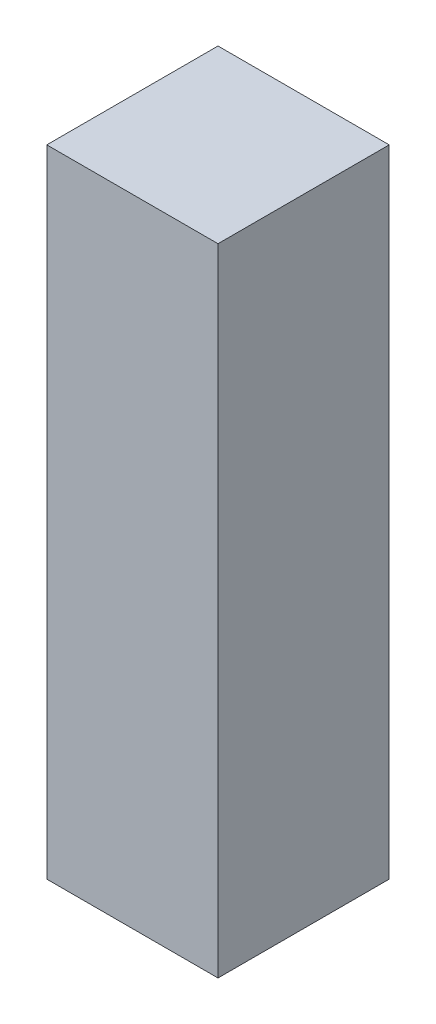
ISO-10303-21;
HEADER;
FILE_DESCRIPTION(('STEP AP214'),'2;1');
FILE_NAME('part.step','',(''),(''),'','','');
FILE_SCHEMA(('AUTOMOTIVE_DESIGN { 1 0 10303 214 1 1 1 1 }'));
ENDSEC;
DATA;
#1=APPLICATION_CONTEXT('core data for automotive mechanical design processes');
#2=APPLICATION_PROTOCOL_DEFINITION('international standard','automotive_design',2000,#1);
#3=PRODUCT_CONTEXT('',#1,'mechanical');
#4=PRODUCT('Part','Part','',(#3));
#5=PRODUCT_RELATED_PRODUCT_CATEGORY('part','',(#4));
#6=PRODUCT_DEFINITION_FORMATION('','',#4);
#7=PRODUCT_DEFINITION_CONTEXT('part definition',#1,'design');
#8=PRODUCT_DEFINITION('design','',#6,#7);
#9=PRODUCT_DEFINITION_SHAPE('','',#8);
#10=(LENGTH_UNIT() NAMED_UNIT(*) SI_UNIT(.MILLI.,.METRE.));
#11=(NAMED_UNIT(*) PLANE_ANGLE_UNIT() SI_UNIT($,.RADIAN.));
#12=(NAMED_UNIT(*) SI_UNIT($,.STERADIAN.) SOLID_ANGLE_UNIT());
#13=UNCERTAINTY_MEASURE_WITH_UNIT(LENGTH_MEASURE(1.E-05),#10,'distance_accuracy_value','');
#14=(GEOMETRIC_REPRESENTATION_CONTEXT(3) GLOBAL_UNCERTAINTY_ASSIGNED_CONTEXT((#13)) GLOBAL_UNIT_ASSIGNED_CONTEXT((#10,
#11,#12)) REPRESENTATION_CONTEXT('',''));
#15=CARTESIAN_POINT('',(0.,0.,0.));
#16=DIRECTION('',(0.,0.,1.));
#17=DIRECTION('',(1.,0.,0.));
#18=AXIS2_PLACEMENT_3D('',#15,#16,#17);
#19=CARTESIAN_POINT('',(0.,330.2,-88.9));
#20=DIRECTION('',(0.,0.,-1.));
#21=DIRECTION('',(-1.,0.,0.));
#22=AXIS2_PLACEMENT_3D('',#19,#20,#21);
#23=PLANE('',#22);
#24=DIRECTION('',(1.,0.,0.));
#25=VECTOR('',#24,1.);
#26=CARTESIAN_POINT('',(0.,0.,-88.9));
#27=LINE('',#26,#25);
#28=CARTESIAN_POINT('',(0.,0.,-88.9));
#29=VERTEX_POINT('',#28);
#30=CARTESIAN_POINT('',(88.9,0.,-88.9));
#31=VERTEX_POINT('',#30);
#32=EDGE_CURVE('E97',#29,#31,#27,.T.);
#33=ORIENTED_EDGE('',*,*,#32,.F.);
#34=DIRECTION('',(0.,-1.,0.));
#35=VECTOR('',#34,1.);
#36=CARTESIAN_POINT('',(0.,330.2,-88.9));
#37=LINE('',#36,#35);
#38=CARTESIAN_POINT('',(0.,330.2,-88.9));
#39=VERTEX_POINT('',#38);
#40=EDGE_CURVE('E11',#39,#29,#37,.T.);
#41=ORIENTED_EDGE('',*,*,#40,.F.);
#42=DIRECTION('',(1.,0.,0.));
#43=VECTOR('',#42,1.);
#44=CARTESIAN_POINT('',(0.,330.2,-88.9));
#45=LINE('',#44,#43);
#46=CARTESIAN_POINT('',(88.9,330.2,-88.9));
#47=VERTEX_POINT('',#46);
#48=EDGE_CURVE('E91',#39,#47,#45,.T.);
#49=ORIENTED_EDGE('',*,*,#48,.T.);
#50=DIRECTION('',(0.,-1.,0.));
#51=VECTOR('',#50,1.);
#52=CARTESIAN_POINT('',(88.9,330.2,-88.9));
#53=LINE('',#52,#51);
#54=EDGE_CURVE('E36',#47,#31,#53,.T.);
#55=ORIENTED_EDGE('',*,*,#54,.T.);
#56=EDGE_LOOP('',(#33,#41,#49,#55));
#57=FACE_BOUND('',#56,.T.);
#58=ADVANCED_FACE('F33',(#57),#23,.T.);
#59=CARTESIAN_POINT('',(0.,330.2,0.));
#60=DIRECTION('',(-1.,0.,0.));
#61=DIRECTION('',(0.,0.,1.));
#62=AXIS2_PLACEMENT_3D('',#59,#60,#61);
#63=PLANE('',#62);
#64=DIRECTION('',(0.,0.,-1.));
#65=VECTOR('',#64,1.);
#66=CARTESIAN_POINT('',(0.,0.,0.));
#67=LINE('',#66,#65);
#68=CARTESIAN_POINT('',(0.,0.,0.));
#69=VERTEX_POINT('',#68);
#70=EDGE_CURVE('E93',#69,#29,#67,.T.);
#71=ORIENTED_EDGE('',*,*,#70,.F.);
#72=DIRECTION('',(0.,-1.,0.));
#73=VECTOR('',#72,1.);
#74=CARTESIAN_POINT('',(0.,330.2,0.));
#75=LINE('',#74,#73);
#76=CARTESIAN_POINT('',(0.,330.2,0.));
#77=VERTEX_POINT('',#76);
#78=EDGE_CURVE('E42',#77,#69,#75,.T.);
#79=ORIENTED_EDGE('',*,*,#78,.F.);
#80=DIRECTION('',(0.,0.,-1.));
#81=VECTOR('',#80,1.);
#82=CARTESIAN_POINT('',(0.,330.2,0.));
#83=LINE('',#82,#81);
#84=EDGE_CURVE('E81',#77,#39,#83,.T.);
#85=ORIENTED_EDGE('',*,*,#84,.T.);
#86=ORIENTED_EDGE('',*,*,#40,.T.);
#87=EDGE_LOOP('',(#71,#79,#85,#86));
#88=FACE_BOUND('',#87,.T.);
#89=ADVANCED_FACE('F107',(#88),#63,.T.);
#90=CARTESIAN_POINT('',(0.,330.2,0.));
#91=DIRECTION('',(0.,0.,-1.));
#92=DIRECTION('',(-1.,0.,0.));
#93=AXIS2_PLACEMENT_3D('',#90,#91,#92);
#94=PLANE('',#93);
#95=DIRECTION('',(1.,0.,0.));
#96=VECTOR('',#95,1.);
#97=CARTESIAN_POINT('',(0.,0.,0.));
#98=LINE('',#97,#96);
#99=CARTESIAN_POINT('',(88.9,0.,0.));
#100=VERTEX_POINT('',#99);
#101=EDGE_CURVE('E86',#69,#100,#98,.T.);
#102=ORIENTED_EDGE('',*,*,#101,.T.);
#103=DIRECTION('',(0.,-1.,0.));
#104=VECTOR('',#103,1.);
#105=CARTESIAN_POINT('',(88.9,330.2,0.));
#106=LINE('',#105,#104);
#107=CARTESIAN_POINT('',(88.9,330.2,0.));
#108=VERTEX_POINT('',#107);
#109=EDGE_CURVE('E84',#108,#100,#106,.T.);
#110=ORIENTED_EDGE('',*,*,#109,.F.);
#111=DIRECTION('',(1.,0.,0.));
#112=VECTOR('',#111,1.);
#113=CARTESIAN_POINT('',(0.,330.2,0.));
#114=LINE('',#113,#112);
#115=EDGE_CURVE('E78',#77,#108,#114,.T.);
#116=ORIENTED_EDGE('',*,*,#115,.F.);
#117=ORIENTED_EDGE('',*,*,#78,.T.);
#118=EDGE_LOOP('',(#102,#110,#116,#117));
#119=FACE_BOUND('',#118,.T.);
#120=ADVANCED_FACE('F85',(#119),#94,.F.);
#121=CARTESIAN_POINT('',(88.9,330.2,0.));
#122=DIRECTION('',(-1.,0.,0.));
#123=DIRECTION('',(0.,0.,1.));
#124=AXIS2_PLACEMENT_3D('',#121,#122,#123);
#125=PLANE('',#124);
#126=DIRECTION('',(0.,0.,-1.));
#127=VECTOR('',#126,1.);
#128=CARTESIAN_POINT('',(88.9,0.,0.));
#129=LINE('',#128,#127);
#130=EDGE_CURVE('E100',#100,#31,#129,.T.);
#131=ORIENTED_EDGE('',*,*,#130,.T.);
#132=ORIENTED_EDGE('',*,*,#54,.F.);
#133=DIRECTION('',(0.,0.,-1.));
#134=VECTOR('',#133,1.);
#135=CARTESIAN_POINT('',(88.9,330.2,0.));
#136=LINE('',#135,#134);
#137=EDGE_CURVE('E75',#108,#47,#136,.T.);
#138=ORIENTED_EDGE('',*,*,#137,.F.);
#139=ORIENTED_EDGE('',*,*,#109,.T.);
#140=EDGE_LOOP('',(#131,#132,#138,#139));
#141=FACE_BOUND('',#140,.T.);
#142=ADVANCED_FACE('F90',(#141),#125,.F.);
#143=CARTESIAN_POINT('',(0.,330.2,0.));
#144=DIRECTION('',(0.,1.,0.));
#145=DIRECTION('',(0.,0.,1.));
#146=AXIS2_PLACEMENT_3D('',#143,#144,#145);
#147=PLANE('',#146);
#148=ORIENTED_EDGE('',*,*,#48,.F.);
#149=ORIENTED_EDGE('',*,*,#84,.F.);
#150=ORIENTED_EDGE('',*,*,#115,.T.);
#151=ORIENTED_EDGE('',*,*,#137,.T.);
#152=EDGE_LOOP('',(#148,#149,#150,#151));
#153=FACE_BOUND('',#152,.T.);
#154=ADVANCED_FACE('F80',(#153),#147,.T.);
#155=CARTESIAN_POINT('',(0.,0.,0.));
#156=DIRECTION('',(0.,1.,0.));
#157=DIRECTION('',(0.,0.,1.));
#158=AXIS2_PLACEMENT_3D('',#155,#156,#157);
#159=PLANE('',#158);
#160=ORIENTED_EDGE('',*,*,#32,.T.);
#161=ORIENTED_EDGE('',*,*,#130,.F.);
#162=ORIENTED_EDGE('',*,*,#101,.F.);
#163=ORIENTED_EDGE('',*,*,#70,.T.);
#164=EDGE_LOOP('',(#160,#161,#162,#163));
#165=FACE_BOUND('',#164,.T.);
#166=ADVANCED_FACE('F106',(#165),#159,.F.);
#167=CLOSED_SHELL('',(#58,#89,#120,#142,#154,#166));
#168=MANIFOLD_SOLID_BREP('B2',#167);
#169=ADVANCED_BREP_SHAPE_REPRESENTATION('',(#18,#168),#14);
#170=SHAPE_DEFINITION_REPRESENTATION(#9,#169);
ENDSEC;
END-ISO-10303-21;
